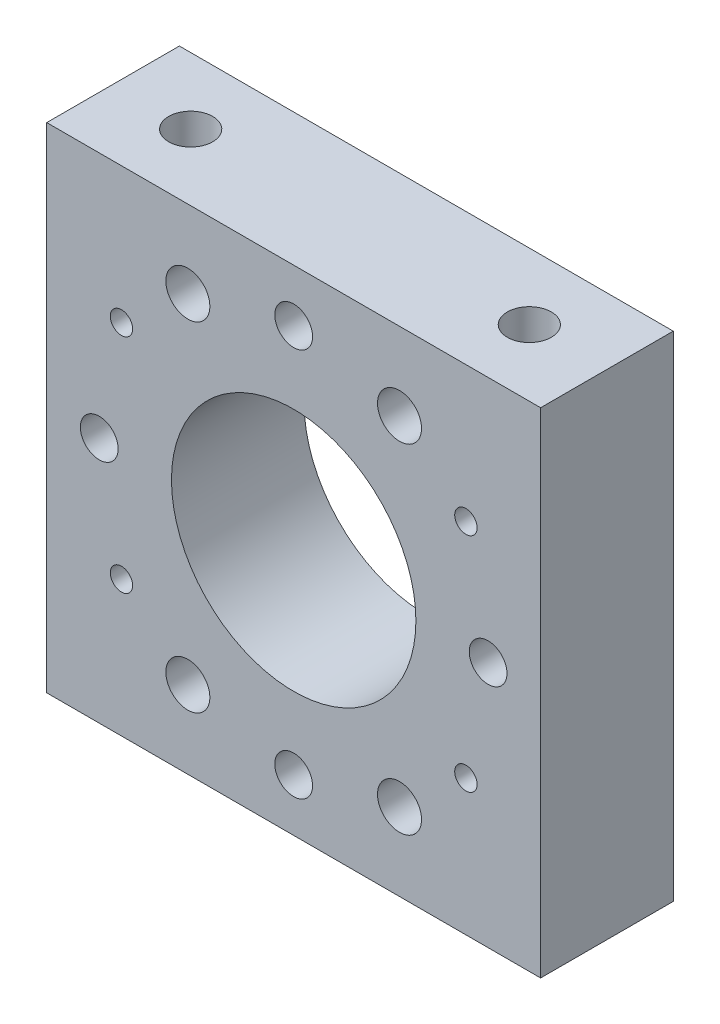
ISO-10303-21;
HEADER;
FILE_DESCRIPTION(('STEP AP214'),'2;1');
FILE_NAME('part.step','',(''),(''),'','','');
FILE_SCHEMA(('AUTOMOTIVE_DESIGN { 1 0 10303 214 1 1 1 1 }'));
ENDSEC;
DATA;
#1=APPLICATION_CONTEXT('core data for automotive mechanical design processes');
#2=APPLICATION_PROTOCOL_DEFINITION('international standard','automotive_design',2000,#1);
#3=PRODUCT_CONTEXT('',#1,'mechanical');
#4=PRODUCT('Part','Part','',(#3));
#5=PRODUCT_RELATED_PRODUCT_CATEGORY('part','',(#4));
#6=PRODUCT_DEFINITION_FORMATION('','',#4);
#7=PRODUCT_DEFINITION_CONTEXT('part definition',#1,'design');
#8=PRODUCT_DEFINITION('design','',#6,#7);
#9=PRODUCT_DEFINITION_SHAPE('','',#8);
#10=(LENGTH_UNIT() NAMED_UNIT(*) SI_UNIT(.MILLI.,.METRE.));
#11=(NAMED_UNIT(*) PLANE_ANGLE_UNIT() SI_UNIT($,.RADIAN.));
#12=(NAMED_UNIT(*) SI_UNIT($,.STERADIAN.) SOLID_ANGLE_UNIT());
#13=UNCERTAINTY_MEASURE_WITH_UNIT(LENGTH_MEASURE(1.E-05),#10,'distance_accuracy_value','');
#14=(GEOMETRIC_REPRESENTATION_CONTEXT(3) GLOBAL_UNCERTAINTY_ASSIGNED_CONTEXT((#13)) GLOBAL_UNIT_ASSIGNED_CONTEXT((#10,
#11,#12)) REPRESENTATION_CONTEXT('',''));
#15=CARTESIAN_POINT('',(0.,0.,0.));
#16=DIRECTION('',(0.,0.,1.));
#17=DIRECTION('',(1.,0.,0.));
#18=AXIS2_PLACEMENT_3D('',#15,#16,#17);
#19=CARTESIAN_POINT('',(-15.24,16.2250000010999,0.));
#20=DIRECTION('',(0.,1.,0.));
#21=DIRECTION('',(0.,0.,1.));
#22=AXIS2_PLACEMENT_3D('',#19,#20,#21);
#23=CONICAL_SURFACE('',#22,1.98099999921056,1.02974425749285);
#24=CARTESIAN_POINT('',(-15.240000000091,15.0346951120923,0.));
#25=VERTEX_POINT('',#24);
#26=VERTEX_LOOP('',#25);
#27=FACE_BOUND('',#26,.T.);
#28=CARTESIAN_POINT('',(-15.24,16.225,0.));
#29=DIRECTION('',(0.,-1.,0.));
#30=DIRECTION('',(0.,0.,-1.));
#31=AXIS2_PLACEMENT_3D('',#28,#29,#30);
#32=CIRCLE('',#31,1.981);
#33=CARTESIAN_POINT('',(-15.24,16.225,-1.981));
#34=VERTEX_POINT('',#33);
#35=EDGE_CURVE('E74',#34,#34,#32,.F.);
#36=ORIENTED_EDGE('',*,*,#35,.T.);
#37=EDGE_LOOP('',(#36));
#38=FACE_BOUND('',#37,.T.);
#39=ADVANCED_FACE('F17',(#27,#38),#23,.F.);
#40=CARTESIAN_POINT('',(15.24,16.225,0.));
#41=DIRECTION('',(0.,1.,0.));
#42=DIRECTION('',(-1.,0.,0.));
#43=AXIS2_PLACEMENT_3D('',#40,#41,#42);
#44=CONICAL_SURFACE('',#43,1.981,1.02974425867665);
#45=CARTESIAN_POINT('',(15.24,15.0346951137064,0.));
#46=VERTEX_POINT('',#45);
#47=VERTEX_LOOP('',#46);
#48=FACE_BOUND('',#47,.T.);
#49=CARTESIAN_POINT('',(15.24,16.225,0.));
#50=DIRECTION('',(0.,1.,0.));
#51=DIRECTION('',(-1.,0.,0.));
#52=AXIS2_PLACEMENT_3D('',#49,#50,#51);
#53=CIRCLE('',#52,1.981);
#54=CARTESIAN_POINT('',(13.259,16.225,0.));
#55=VERTEX_POINT('',#54);
#56=EDGE_CURVE('E76',#55,#55,#53,.T.);
#57=ORIENTED_EDGE('',*,*,#56,.T.);
#58=EDGE_LOOP('',(#57));
#59=FACE_BOUND('',#58,.T.);
#60=ADVANCED_FACE('F70',(#48,#59),#44,.F.);
#61=CARTESIAN_POINT('',(-15.24,-16.225,0.));
#62=DIRECTION('',(0.,-1.,0.));
#63=DIRECTION('',(1.,0.,0.));
#64=AXIS2_PLACEMENT_3D('',#61,#62,#63);
#65=CONICAL_SURFACE('',#64,1.981,1.02974425867665);
#66=CARTESIAN_POINT('',(-15.24,-15.0346951137064,0.));
#67=VERTEX_POINT('',#66);
#68=VERTEX_LOOP('',#67);
#69=FACE_BOUND('',#68,.T.);
#70=CARTESIAN_POINT('',(-15.24,-16.225,0.));
#71=DIRECTION('',(0.,-1.,0.));
#72=DIRECTION('',(1.,0.,0.));
#73=AXIS2_PLACEMENT_3D('',#70,#71,#72);
#74=CIRCLE('',#73,1.981);
#75=CARTESIAN_POINT('',(-13.259,-16.225,0.));
#76=VERTEX_POINT('',#75);
#77=EDGE_CURVE('E79',#76,#76,#74,.T.);
#78=ORIENTED_EDGE('',*,*,#77,.T.);
#79=EDGE_LOOP('',(#78));
#80=FACE_BOUND('',#79,.T.);
#81=ADVANCED_FACE('F330',(#69,#80),#65,.F.);
#82=CARTESIAN_POINT('',(15.24,-16.2250000010999,0.));
#83=DIRECTION('',(0.,-1.,0.));
#84=DIRECTION('',(0.,0.,-1.));
#85=AXIS2_PLACEMENT_3D('',#82,#83,#84);
#86=CONICAL_SURFACE('',#85,1.98099999921056,1.02974425749285);
#87=CARTESIAN_POINT('',(15.240000000091,-15.0346951120923,0.));
#88=VERTEX_POINT('',#87);
#89=VERTEX_LOOP('',#88);
#90=FACE_BOUND('',#89,.T.);
#91=CARTESIAN_POINT('',(15.24,-16.225,0.));
#92=DIRECTION('',(0.,1.,0.));
#93=DIRECTION('',(0.,0.,1.));
#94=AXIS2_PLACEMENT_3D('',#91,#92,#93);
#95=CIRCLE('',#94,1.981);
#96=CARTESIAN_POINT('',(15.24,-16.225,1.981));
#97=VERTEX_POINT('',#96);
#98=EDGE_CURVE('E197',#97,#97,#95,.F.);
#99=ORIENTED_EDGE('',*,*,#98,.T.);
#100=EDGE_LOOP('',(#99));
#101=FACE_BOUND('',#100,.T.);
#102=ADVANCED_FACE('F327',(#90,#101),#86,.F.);
#103=CARTESIAN_POINT('',(0.,-17.5,-5.969));
#104=DIRECTION('',(0.,0.,1.));
#105=DIRECTION('',(1.,0.,0.));
#106=AXIS2_PLACEMENT_3D('',#103,#104,#105);
#107=CYLINDRICAL_SURFACE('',#106,3.);
#108=CARTESIAN_POINT('',(0.,-17.5,-0.469000000000004));
#109=DIRECTION('',(0.,0.,1.));
#110=DIRECTION('',(1.,0.,0.));
#111=AXIS2_PLACEMENT_3D('',#108,#109,#110);
#112=CIRCLE('',#111,3.);
#113=CARTESIAN_POINT('',(3.,-17.5,-0.469000000000004));
#114=VERTEX_POINT('',#113);
#115=EDGE_CURVE('E21',#114,#114,#112,.T.);
#116=ORIENTED_EDGE('',*,*,#115,.T.);
#117=EDGE_LOOP('',(#116));
#118=FACE_BOUND('',#117,.T.);
#119=CARTESIAN_POINT('',(0.,-17.5,-5.969));
#120=DIRECTION('',(0.,0.,1.));
#121=DIRECTION('',(1.,0.,0.));
#122=AXIS2_PLACEMENT_3D('',#119,#120,#121);
#123=CIRCLE('',#122,3.);
#124=CARTESIAN_POINT('',(3.,-17.5,-5.969));
#125=VERTEX_POINT('',#124);
#126=EDGE_CURVE('E184',#125,#125,#123,.F.);
#127=ORIENTED_EDGE('',*,*,#126,.T.);
#128=EDGE_LOOP('',(#127));
#129=FACE_BOUND('',#128,.T.);
#130=ADVANCED_FACE('F329',(#118,#129),#107,.F.);
#131=CARTESIAN_POINT('',(17.5,0.,-5.969));
#132=DIRECTION('',(0.,0.,1.));
#133=DIRECTION('',(1.,0.,0.));
#134=AXIS2_PLACEMENT_3D('',#131,#132,#133);
#135=CYLINDRICAL_SURFACE('',#134,3.);
#136=CARTESIAN_POINT('',(17.5,0.,-0.469000000000004));
#137=DIRECTION('',(0.,0.,1.));
#138=DIRECTION('',(1.,0.,0.));
#139=AXIS2_PLACEMENT_3D('',#136,#137,#138);
#140=CIRCLE('',#139,3.);
#141=CARTESIAN_POINT('',(20.5,0.,-0.469000000000004));
#142=VERTEX_POINT('',#141);
#143=EDGE_CURVE('E192',#142,#142,#140,.T.);
#144=ORIENTED_EDGE('',*,*,#143,.T.);
#145=EDGE_LOOP('',(#144));
#146=FACE_BOUND('',#145,.T.);
#147=CARTESIAN_POINT('',(17.5,0.,-5.969));
#148=DIRECTION('',(0.,0.,1.));
#149=DIRECTION('',(1.,0.,0.));
#150=AXIS2_PLACEMENT_3D('',#147,#148,#149);
#151=CIRCLE('',#150,3.);
#152=CARTESIAN_POINT('',(20.5,0.,-5.969));
#153=VERTEX_POINT('',#152);
#154=EDGE_CURVE('E181',#153,#153,#151,.F.);
#155=ORIENTED_EDGE('',*,*,#154,.T.);
#156=EDGE_LOOP('',(#155));
#157=FACE_BOUND('',#156,.T.);
#158=ADVANCED_FACE('F340',(#146,#157),#135,.F.);
#159=CARTESIAN_POINT('',(-17.5,0.,-5.969));
#160=DIRECTION('',(0.,0.,1.));
#161=DIRECTION('',(1.,0.,0.));
#162=AXIS2_PLACEMENT_3D('',#159,#160,#161);
#163=CYLINDRICAL_SURFACE('',#162,3.);
#164=CARTESIAN_POINT('',(-17.5,0.,-0.469000000000004));
#165=DIRECTION('',(0.,0.,1.));
#166=DIRECTION('',(1.,0.,0.));
#167=AXIS2_PLACEMENT_3D('',#164,#165,#166);
#168=CIRCLE('',#167,3.);
#169=CARTESIAN_POINT('',(-14.5,0.,-0.469000000000004));
#170=VERTEX_POINT('',#169);
#171=EDGE_CURVE('E190',#170,#170,#168,.T.);
#172=ORIENTED_EDGE('',*,*,#171,.T.);
#173=EDGE_LOOP('',(#172));
#174=FACE_BOUND('',#173,.T.);
#175=CARTESIAN_POINT('',(-17.5,0.,-5.969));
#176=DIRECTION('',(0.,0.,1.));
#177=DIRECTION('',(1.,0.,0.));
#178=AXIS2_PLACEMENT_3D('',#175,#176,#177);
#179=CIRCLE('',#178,3.);
#180=CARTESIAN_POINT('',(-14.5,0.,-5.969));
#181=VERTEX_POINT('',#180);
#182=EDGE_CURVE('E178',#181,#181,#179,.F.);
#183=ORIENTED_EDGE('',*,*,#182,.T.);
#184=EDGE_LOOP('',(#183));
#185=FACE_BOUND('',#184,.T.);
#186=ADVANCED_FACE('F343',(#174,#185),#163,.F.);
#187=CARTESIAN_POINT('',(0.,17.5,-5.969));
#188=DIRECTION('',(0.,0.,1.));
#189=DIRECTION('',(1.,0.,0.));
#190=AXIS2_PLACEMENT_3D('',#187,#188,#189);
#191=CYLINDRICAL_SURFACE('',#190,3.);
#192=CARTESIAN_POINT('',(0.,17.5,-0.469000000000004));
#193=DIRECTION('',(0.,0.,1.));
#194=DIRECTION('',(1.,0.,0.));
#195=AXIS2_PLACEMENT_3D('',#192,#193,#194);
#196=CIRCLE('',#195,3.);
#197=CARTESIAN_POINT('',(3.,17.5,-0.469000000000004));
#198=VERTEX_POINT('',#197);
#199=EDGE_CURVE('E187',#198,#198,#196,.T.);
#200=ORIENTED_EDGE('',*,*,#199,.T.);
#201=EDGE_LOOP('',(#200));
#202=FACE_BOUND('',#201,.T.);
#203=CARTESIAN_POINT('',(0.,17.5,-5.969));
#204=DIRECTION('',(0.,0.,1.));
#205=DIRECTION('',(1.,0.,0.));
#206=AXIS2_PLACEMENT_3D('',#203,#204,#205);
#207=CIRCLE('',#206,3.);
#208=CARTESIAN_POINT('',(3.,17.5,-5.969));
#209=VERTEX_POINT('',#208);
#210=EDGE_CURVE('E174',#209,#209,#207,.F.);
#211=ORIENTED_EDGE('',*,*,#210,.T.);
#212=EDGE_LOOP('',(#211));
#213=FACE_BOUND('',#212,.T.);
#214=ADVANCED_FACE('F325',(#202,#213),#191,.F.);
#215=CARTESIAN_POINT('',(-15.24,19.225,0.));
#216=DIRECTION('',(0.,-1.,0.));
#217=DIRECTION('',(0.,0.,-1.));
#218=AXIS2_PLACEMENT_3D('',#215,#216,#217);
#219=CYLINDRICAL_SURFACE('',#218,1.981);
#220=CARTESIAN_POINT('',(-15.24,22.225,0.));
#221=DIRECTION('',(0.,-1.,0.));
#222=DIRECTION('',(0.,0.,-1.));
#223=AXIS2_PLACEMENT_3D('',#220,#221,#222);
#224=CIRCLE('',#223,1.981);
#225=CARTESIAN_POINT('',(-15.24,22.225,-1.981));
#226=VERTEX_POINT('',#225);
#227=EDGE_CURVE('E170',#226,#226,#224,.T.);
#228=ORIENTED_EDGE('',*,*,#227,.F.);
#229=EDGE_LOOP('',(#228));
#230=FACE_BOUND('',#229,.T.);
#231=ORIENTED_EDGE('',*,*,#35,.F.);
#232=EDGE_LOOP('',(#231));
#233=FACE_BOUND('',#232,.T.);
#234=ADVANCED_FACE('F321',(#230,#233),#219,.F.);
#235=CARTESIAN_POINT('',(15.24,22.225,0.));
#236=DIRECTION('',(0.,-1.,0.));
#237=DIRECTION('',(0.,0.,-1.));
#238=AXIS2_PLACEMENT_3D('',#235,#236,#237);
#239=CYLINDRICAL_SURFACE('',#238,1.981);
#240=CARTESIAN_POINT('',(15.24,22.225,0.));
#241=DIRECTION('',(0.,-1.,0.));
#242=DIRECTION('',(0.,0.,-1.));
#243=AXIS2_PLACEMENT_3D('',#240,#241,#242);
#244=CIRCLE('',#243,1.981);
#245=CARTESIAN_POINT('',(15.24,22.225,-1.981));
#246=VERTEX_POINT('',#245);
#247=EDGE_CURVE('E166',#246,#246,#244,.T.);
#248=ORIENTED_EDGE('',*,*,#247,.F.);
#249=EDGE_LOOP('',(#248));
#250=FACE_BOUND('',#249,.T.);
#251=ORIENTED_EDGE('',*,*,#56,.F.);
#252=EDGE_LOOP('',(#251));
#253=FACE_BOUND('',#252,.T.);
#254=ADVANCED_FACE('F324',(#250,#253),#239,.F.);
#255=CARTESIAN_POINT('',(-15.24,-22.225,0.));
#256=DIRECTION('',(0.,1.,0.));
#257=DIRECTION('',(0.,0.,1.));
#258=AXIS2_PLACEMENT_3D('',#255,#256,#257);
#259=CYLINDRICAL_SURFACE('',#258,1.981);
#260=CARTESIAN_POINT('',(-15.24,-22.225,0.));
#261=DIRECTION('',(0.,1.,0.));
#262=DIRECTION('',(0.,0.,1.));
#263=AXIS2_PLACEMENT_3D('',#260,#261,#262);
#264=CIRCLE('',#263,1.981);
#265=CARTESIAN_POINT('',(-15.24,-22.225,1.981));
#266=VERTEX_POINT('',#265);
#267=EDGE_CURVE('E162',#266,#266,#264,.T.);
#268=ORIENTED_EDGE('',*,*,#267,.F.);
#269=EDGE_LOOP('',(#268));
#270=FACE_BOUND('',#269,.T.);
#271=ORIENTED_EDGE('',*,*,#77,.F.);
#272=EDGE_LOOP('',(#271));
#273=FACE_BOUND('',#272,.T.);
#274=ADVANCED_FACE('F319',(#270,#273),#259,.F.);
#275=CARTESIAN_POINT('',(15.24,-19.225,0.));
#276=DIRECTION('',(0.,1.,0.));
#277=DIRECTION('',(0.,0.,1.));
#278=AXIS2_PLACEMENT_3D('',#275,#276,#277);
#279=CYLINDRICAL_SURFACE('',#278,1.981);
#280=CARTESIAN_POINT('',(15.24,-22.225,0.));
#281=DIRECTION('',(0.,1.,0.));
#282=DIRECTION('',(0.,0.,1.));
#283=AXIS2_PLACEMENT_3D('',#280,#281,#282);
#284=CIRCLE('',#283,1.981);
#285=CARTESIAN_POINT('',(15.24,-22.225,1.981));
#286=VERTEX_POINT('',#285);
#287=EDGE_CURVE('E159',#286,#286,#284,.T.);
#288=ORIENTED_EDGE('',*,*,#287,.F.);
#289=EDGE_LOOP('',(#288));
#290=FACE_BOUND('',#289,.T.);
#291=ORIENTED_EDGE('',*,*,#98,.F.);
#292=EDGE_LOOP('',(#291));
#293=FACE_BOUND('',#292,.T.);
#294=ADVANCED_FACE('F315',(#290,#293),#279,.F.);
#295=CARTESIAN_POINT('',(-2.99999999999999,-20.56,-0.469000000000004));
#296=DIRECTION('',(0.,0.,1.));
#297=DIRECTION('',(1.,0.,0.));
#298=AXIS2_PLACEMENT_3D('',#295,#296,#297);
#299=PLANE('',#298);
#300=CARTESIAN_POINT('',(0.,-17.5,-0.469000000000004));
#301=DIRECTION('',(0.,0.,1.));
#302=DIRECTION('',(1.,0.,0.));
#303=AXIS2_PLACEMENT_3D('',#300,#301,#302);
#304=CIRCLE('',#303,1.70000000000001);
#305=CARTESIAN_POINT('',(1.70000000000001,-17.5,-0.469000000000004));
#306=VERTEX_POINT('',#305);
#307=EDGE_CURVE('E132',#306,#306,#304,.T.);
#308=ORIENTED_EDGE('',*,*,#307,.T.);
#309=EDGE_LOOP('',(#308));
#310=FACE_BOUND('',#309,.T.);
#311=ORIENTED_EDGE('',*,*,#115,.F.);
#312=EDGE_LOOP('',(#311));
#313=FACE_BOUND('',#312,.T.);
#314=ADVANCED_FACE('F318',(#310,#313),#299,.F.);
#315=CARTESIAN_POINT('',(20.56,-2.99999999999999,-0.469000000000004));
#316=DIRECTION('',(0.,0.,1.));
#317=DIRECTION('',(0.,1.,0.));
#318=AXIS2_PLACEMENT_3D('',#315,#316,#317);
#319=PLANE('',#318);
#320=CARTESIAN_POINT('',(17.5,0.,-0.469000000000004));
#321=DIRECTION('',(0.,0.,1.));
#322=DIRECTION('',(1.,0.,0.));
#323=AXIS2_PLACEMENT_3D('',#320,#321,#322);
#324=CIRCLE('',#323,1.70000000000001);
#325=CARTESIAN_POINT('',(19.2,0.,-0.469000000000004));
#326=VERTEX_POINT('',#325);
#327=EDGE_CURVE('E129',#326,#326,#324,.T.);
#328=ORIENTED_EDGE('',*,*,#327,.T.);
#329=EDGE_LOOP('',(#328));
#330=FACE_BOUND('',#329,.T.);
#331=ORIENTED_EDGE('',*,*,#143,.F.);
#332=EDGE_LOOP('',(#331));
#333=FACE_BOUND('',#332,.T.);
#334=ADVANCED_FACE('F358',(#330,#333),#319,.F.);
#335=CARTESIAN_POINT('',(-20.56,2.99999999999999,-0.469000000000004));
#336=DIRECTION('',(0.,0.,1.));
#337=DIRECTION('',(0.,-1.,0.));
#338=AXIS2_PLACEMENT_3D('',#335,#336,#337);
#339=PLANE('',#338);
#340=CARTESIAN_POINT('',(-17.5,0.,-0.469000000000004));
#341=DIRECTION('',(0.,0.,1.));
#342=DIRECTION('',(1.,0.,0.));
#343=AXIS2_PLACEMENT_3D('',#340,#341,#342);
#344=CIRCLE('',#343,1.70000000000001);
#345=CARTESIAN_POINT('',(-15.8,0.,-0.469000000000004));
#346=VERTEX_POINT('',#345);
#347=EDGE_CURVE('E126',#346,#346,#344,.T.);
#348=ORIENTED_EDGE('',*,*,#347,.T.);
#349=EDGE_LOOP('',(#348));
#350=FACE_BOUND('',#349,.T.);
#351=ORIENTED_EDGE('',*,*,#171,.F.);
#352=EDGE_LOOP('',(#351));
#353=FACE_BOUND('',#352,.T.);
#354=ADVANCED_FACE('F310',(#350,#353),#339,.F.);
#355=CARTESIAN_POINT('',(2.99999999999999,20.56,-0.469000000000004));
#356=DIRECTION('',(0.,0.,1.));
#357=DIRECTION('',(-1.,0.,0.));
#358=AXIS2_PLACEMENT_3D('',#355,#356,#357);
#359=PLANE('',#358);
#360=CARTESIAN_POINT('',(0.,17.5,-0.469000000000004));
#361=DIRECTION('',(0.,0.,1.));
#362=DIRECTION('',(1.,0.,0.));
#363=AXIS2_PLACEMENT_3D('',#360,#361,#362);
#364=CIRCLE('',#363,1.70000000000001);
#365=CARTESIAN_POINT('',(1.70000000000001,17.5,-0.469000000000004));
#366=VERTEX_POINT('',#365);
#367=EDGE_CURVE('E123',#366,#366,#364,.T.);
#368=ORIENTED_EDGE('',*,*,#367,.T.);
#369=EDGE_LOOP('',(#368));
#370=FACE_BOUND('',#369,.T.);
#371=ORIENTED_EDGE('',*,*,#199,.F.);
#372=EDGE_LOOP('',(#371));
#373=FACE_BOUND('',#372,.T.);
#374=ADVANCED_FACE('F300',(#370,#373),#359,.F.);
#375=CARTESIAN_POINT('',(0.,0.,-5.969));
#376=DIRECTION('',(0.,0.,1.));
#377=DIRECTION('',(1.,0.,0.));
#378=AXIS2_PLACEMENT_3D('',#375,#376,#377);
#379=PLANE('',#378);
#380=CARTESIAN_POINT('',(0.,0.,-5.969));
#381=DIRECTION('',(0.,0.,1.));
#382=DIRECTION('',(1.,0.,0.));
#383=AXIS2_PLACEMENT_3D('',#380,#381,#382);
#384=CIRCLE('',#383,11.);
#385=CARTESIAN_POINT('',(11.,0.,-5.969));
#386=VERTEX_POINT('',#385);
#387=EDGE_CURVE('E119',#386,#386,#384,.T.);
#388=ORIENTED_EDGE('',*,*,#387,.T.);
#389=EDGE_LOOP('',(#388));
#390=FACE_BOUND('',#389,.T.);
#391=ORIENTED_EDGE('',*,*,#210,.F.);
#392=EDGE_LOOP('',(#391));
#393=FACE_BOUND('',#392,.T.);
#394=ORIENTED_EDGE('',*,*,#182,.F.);
#395=EDGE_LOOP('',(#394));
#396=FACE_BOUND('',#395,.T.);
#397=ORIENTED_EDGE('',*,*,#154,.F.);
#398=EDGE_LOOP('',(#397));
#399=FACE_BOUND('',#398,.T.);
#400=ORIENTED_EDGE('',*,*,#126,.F.);
#401=EDGE_LOOP('',(#400));
#402=FACE_BOUND('',#401,.T.);
#403=CARTESIAN_POINT('',(9.525,15.24,-5.969));
#404=DIRECTION('',(0.,0.,1.));
#405=DIRECTION('',(1.,0.,0.));
#406=AXIS2_PLACEMENT_3D('',#403,#404,#405);
#407=CIRCLE('',#406,1.981);
#408=CARTESIAN_POINT('',(11.506,15.24,-5.969));
#409=VERTEX_POINT('',#408);
#410=EDGE_CURVE('E135',#409,#409,#407,.T.);
#411=ORIENTED_EDGE('',*,*,#410,.T.);
#412=EDGE_LOOP('',(#411));
#413=FACE_BOUND('',#412,.T.);
#414=CARTESIAN_POINT('',(-9.525,15.24,-5.96899999999999));
#415=DIRECTION('',(0.,0.,1.));
#416=DIRECTION('',(1.,0.,0.));
#417=AXIS2_PLACEMENT_3D('',#414,#415,#416);
#418=CIRCLE('',#417,1.981);
#419=CARTESIAN_POINT('',(-7.544,15.24,-5.96899999999999));
#420=VERTEX_POINT('',#419);
#421=EDGE_CURVE('E138',#420,#420,#418,.T.);
#422=ORIENTED_EDGE('',*,*,#421,.T.);
#423=EDGE_LOOP('',(#422));
#424=FACE_BOUND('',#423,.T.);
#425=CARTESIAN_POINT('',(9.525,-15.24,-5.96899999999999));
#426=DIRECTION('',(0.,0.,1.));
#427=DIRECTION('',(1.,0.,0.));
#428=AXIS2_PLACEMENT_3D('',#425,#426,#427);
#429=CIRCLE('',#428,1.981);
#430=CARTESIAN_POINT('',(11.506,-15.24,-5.96899999999999));
#431=VERTEX_POINT('',#430);
#432=EDGE_CURVE('E141',#431,#431,#429,.T.);
#433=ORIENTED_EDGE('',*,*,#432,.T.);
#434=EDGE_LOOP('',(#433));
#435=FACE_BOUND('',#434,.T.);
#436=CARTESIAN_POINT('',(-9.525,-15.24,-5.969));
#437=DIRECTION('',(0.,0.,1.));
#438=DIRECTION('',(1.,0.,0.));
#439=AXIS2_PLACEMENT_3D('',#436,#437,#438);
#440=CIRCLE('',#439,1.981);
#441=CARTESIAN_POINT('',(-7.544,-15.24,-5.969));
#442=VERTEX_POINT('',#441);
#443=EDGE_CURVE('E144',#442,#442,#440,.T.);
#444=ORIENTED_EDGE('',*,*,#443,.T.);
#445=EDGE_LOOP('',(#444));
#446=FACE_BOUND('',#445,.T.);
#447=CARTESIAN_POINT('',(15.5,10.,-5.969));
#448=DIRECTION('',(0.,0.,1.));
#449=DIRECTION('',(1.,0.,0.));
#450=AXIS2_PLACEMENT_3D('',#447,#448,#449);
#451=CIRCLE('',#450,1.00650000000002);
#452=CARTESIAN_POINT('',(16.5065,10.,-5.969));
#453=VERTEX_POINT('',#452);
#454=EDGE_CURVE('E147',#453,#453,#451,.T.);
#455=ORIENTED_EDGE('',*,*,#454,.T.);
#456=EDGE_LOOP('',(#455));
#457=FACE_BOUND('',#456,.T.);
#458=CARTESIAN_POINT('',(15.5,-10.,-5.96899999999999));
#459=DIRECTION('',(0.,0.,1.));
#460=DIRECTION('',(1.,0.,0.));
#461=AXIS2_PLACEMENT_3D('',#458,#459,#460);
#462=CIRCLE('',#461,1.00650000000001);
#463=CARTESIAN_POINT('',(16.5065,-10.,-5.96899999999999));
#464=VERTEX_POINT('',#463);
#465=EDGE_CURVE('E150',#464,#464,#462,.T.);
#466=ORIENTED_EDGE('',*,*,#465,.T.);
#467=EDGE_LOOP('',(#466));
#468=FACE_BOUND('',#467,.T.);
#469=CARTESIAN_POINT('',(-15.5,10.,-5.96899999999999));
#470=DIRECTION('',(0.,0.,1.));
#471=DIRECTION('',(1.,0.,0.));
#472=AXIS2_PLACEMENT_3D('',#469,#470,#471);
#473=CIRCLE('',#472,1.00650000000001);
#474=CARTESIAN_POINT('',(-14.4935,10.,-5.96899999999999));
#475=VERTEX_POINT('',#474);
#476=EDGE_CURVE('E153',#475,#475,#473,.T.);
#477=ORIENTED_EDGE('',*,*,#476,.T.);
#478=EDGE_LOOP('',(#477));
#479=FACE_BOUND('',#478,.T.);
#480=CARTESIAN_POINT('',(-15.5,-10.,-5.969));
#481=DIRECTION('',(0.,0.,1.));
#482=DIRECTION('',(1.,0.,0.));
#483=AXIS2_PLACEMENT_3D('',#480,#481,#482);
#484=CIRCLE('',#483,1.00650000000002);
#485=CARTESIAN_POINT('',(-14.4935,-10.,-5.969));
#486=VERTEX_POINT('',#485);
#487=EDGE_CURVE('E156',#486,#486,#484,.T.);
#488=ORIENTED_EDGE('',*,*,#487,.T.);
#489=EDGE_LOOP('',(#488));
#490=FACE_BOUND('',#489,.T.);
#491=DIRECTION('',(1.,0.,0.));
#492=VECTOR('',#491,1.);
#493=CARTESIAN_POINT('',(-22.225,22.225,-5.969));
#494=LINE('',#493,#492);
#495=CARTESIAN_POINT('',(22.225,22.225,-5.969));
#496=VERTEX_POINT('',#495);
#497=CARTESIAN_POINT('',(-22.225,22.225,-5.969));
#498=VERTEX_POINT('',#497);
#499=EDGE_CURVE('E173',#496,#498,#494,.F.);
#500=ORIENTED_EDGE('',*,*,#499,.F.);
#501=DIRECTION('',(0.,1.,0.));
#502=VECTOR('',#501,1.);
#503=CARTESIAN_POINT('',(22.225,22.225,-5.969));
#504=LINE('',#503,#502);
#505=CARTESIAN_POINT('',(22.225,-22.225,-5.969));
#506=VERTEX_POINT('',#505);
#507=EDGE_CURVE('E177',#506,#496,#504,.T.);
#508=ORIENTED_EDGE('',*,*,#507,.F.);
#509=DIRECTION('',(1.,0.,0.));
#510=VECTOR('',#509,1.);
#511=CARTESIAN_POINT('',(22.225,-22.225,-5.969));
#512=LINE('',#511,#510);
#513=CARTESIAN_POINT('',(-22.225,-22.225,-5.969));
#514=VERTEX_POINT('',#513);
#515=EDGE_CURVE('E216',#514,#506,#512,.T.);
#516=ORIENTED_EDGE('',*,*,#515,.F.);
#517=DIRECTION('',(0.,1.,0.));
#518=VECTOR('',#517,1.);
#519=CARTESIAN_POINT('',(-22.225,-22.225,-5.969));
#520=LINE('',#519,#518);
#521=EDGE_CURVE('E213',#498,#514,#520,.F.);
#522=ORIENTED_EDGE('',*,*,#521,.F.);
#523=EDGE_LOOP('',(#500,#508,#516,#522));
#524=FACE_BOUND('',#523,.T.);
#525=ADVANCED_FACE('F297',(#390,#393,#396,#399,#402,#413,#424,#435,#446,#457,#468,#479,#490,
#524),#379,.F.);
#526=CARTESIAN_POINT('',(22.225,22.225,0.));
#527=DIRECTION('',(1.,0.,0.));
#528=DIRECTION('',(0.,0.,-1.));
#529=AXIS2_PLACEMENT_3D('',#526,#527,#528);
#530=PLANE('',#529);
#531=ORIENTED_EDGE('',*,*,#507,.T.);
#532=DIRECTION('',(0.,0.,1.));
#533=VECTOR('',#532,1.);
#534=CARTESIAN_POINT('',(22.225,22.225,0.));
#535=LINE('',#534,#533);
#536=CARTESIAN_POINT('',(22.225,22.225,5.969));
#537=VERTEX_POINT('',#536);
#538=EDGE_CURVE('E207',#537,#496,#535,.F.);
#539=ORIENTED_EDGE('',*,*,#538,.F.);
#540=DIRECTION('',(0.,1.,0.));
#541=VECTOR('',#540,1.);
#542=CARTESIAN_POINT('',(22.225,0.,5.969));
#543=LINE('',#542,#541);
#544=CARTESIAN_POINT('',(22.225,-22.225,5.969));
#545=VERTEX_POINT('',#544);
#546=EDGE_CURVE('E122',#545,#537,#543,.T.);
#547=ORIENTED_EDGE('',*,*,#546,.F.);
#548=DIRECTION('',(0.,0.,-1.));
#549=VECTOR('',#548,1.);
#550=CARTESIAN_POINT('',(22.225,-22.225,0.));
#551=LINE('',#550,#549);
#552=EDGE_CURVE('E165',#506,#545,#551,.F.);
#553=ORIENTED_EDGE('',*,*,#552,.F.);
#554=EDGE_LOOP('',(#531,#539,#547,#553));
#555=FACE_BOUND('',#554,.T.);
#556=ADVANCED_FACE('F237',(#555),#530,.T.);
#557=CARTESIAN_POINT('',(-22.225,22.225,0.));
#558=DIRECTION('',(0.,1.,0.));
#559=DIRECTION('',(0.,0.,1.));
#560=AXIS2_PLACEMENT_3D('',#557,#558,#559);
#561=PLANE('',#560);
#562=ORIENTED_EDGE('',*,*,#247,.T.);
#563=EDGE_LOOP('',(#562));
#564=FACE_BOUND('',#563,.T.);
#565=ORIENTED_EDGE('',*,*,#227,.T.);
#566=EDGE_LOOP('',(#565));
#567=FACE_BOUND('',#566,.T.);
#568=ORIENTED_EDGE('',*,*,#499,.T.);
#569=DIRECTION('',(0.,0.,1.));
#570=VECTOR('',#569,1.);
#571=CARTESIAN_POINT('',(-22.225,22.225,0.));
#572=LINE('',#571,#570);
#573=CARTESIAN_POINT('',(-22.225,22.225,5.969));
#574=VERTEX_POINT('',#573);
#575=EDGE_CURVE('E169',#574,#498,#572,.F.);
#576=ORIENTED_EDGE('',*,*,#575,.F.);
#577=DIRECTION('',(1.,0.,0.));
#578=VECTOR('',#577,1.);
#579=CARTESIAN_POINT('',(0.,22.225,5.969));
#580=LINE('',#579,#578);
#581=EDGE_CURVE('E223',#537,#574,#580,.F.);
#582=ORIENTED_EDGE('',*,*,#581,.F.);
#583=ORIENTED_EDGE('',*,*,#538,.T.);
#584=EDGE_LOOP('',(#568,#576,#582,#583));
#585=FACE_BOUND('',#584,.T.);
#586=ADVANCED_FACE('F241',(#564,#567,#585),#561,.T.);
#587=CARTESIAN_POINT('',(-22.225,-22.225,0.));
#588=DIRECTION('',(-1.,0.,0.));
#589=DIRECTION('',(0.,0.,1.));
#590=AXIS2_PLACEMENT_3D('',#587,#588,#589);
#591=PLANE('',#590);
#592=ORIENTED_EDGE('',*,*,#521,.T.);
#593=DIRECTION('',(0.,0.,-1.));
#594=VECTOR('',#593,1.);
#595=CARTESIAN_POINT('',(-22.225,-22.225,0.));
#596=LINE('',#595,#594);
#597=CARTESIAN_POINT('',(-22.225,-22.225,5.969));
#598=VERTEX_POINT('',#597);
#599=EDGE_CURVE('E36',#598,#514,#596,.T.);
#600=ORIENTED_EDGE('',*,*,#599,.F.);
#601=DIRECTION('',(0.,1.,0.));
#602=VECTOR('',#601,1.);
#603=CARTESIAN_POINT('',(-22.225,0.,5.969));
#604=LINE('',#603,#602);
#605=EDGE_CURVE('E226',#574,#598,#604,.F.);
#606=ORIENTED_EDGE('',*,*,#605,.F.);
#607=ORIENTED_EDGE('',*,*,#575,.T.);
#608=EDGE_LOOP('',(#592,#600,#606,#607));
#609=FACE_BOUND('',#608,.T.);
#610=ADVANCED_FACE('F243',(#609),#591,.T.);
#611=CARTESIAN_POINT('',(22.225,-22.225,0.));
#612=DIRECTION('',(0.,-1.,0.));
#613=DIRECTION('',(0.,0.,-1.));
#614=AXIS2_PLACEMENT_3D('',#611,#612,#613);
#615=PLANE('',#614);
#616=ORIENTED_EDGE('',*,*,#287,.T.);
#617=EDGE_LOOP('',(#616));
#618=FACE_BOUND('',#617,.T.);
#619=ORIENTED_EDGE('',*,*,#267,.T.);
#620=EDGE_LOOP('',(#619));
#621=FACE_BOUND('',#620,.T.);
#622=ORIENTED_EDGE('',*,*,#515,.T.);
#623=ORIENTED_EDGE('',*,*,#552,.T.);
#624=DIRECTION('',(1.,0.,0.));
#625=VECTOR('',#624,1.);
#626=CARTESIAN_POINT('',(0.,-22.225,5.969));
#627=LINE('',#626,#625);
#628=EDGE_CURVE('E118',#598,#545,#627,.T.);
#629=ORIENTED_EDGE('',*,*,#628,.F.);
#630=ORIENTED_EDGE('',*,*,#599,.T.);
#631=EDGE_LOOP('',(#622,#623,#629,#630));
#632=FACE_BOUND('',#631,.T.);
#633=ADVANCED_FACE('F233',(#618,#621,#632),#615,.T.);
#634=CARTESIAN_POINT('',(-15.5,-10.,-5.969));
#635=DIRECTION('',(0.,0.,1.));
#636=DIRECTION('',(1.,0.,0.));
#637=AXIS2_PLACEMENT_3D('',#634,#635,#636);
#638=CYLINDRICAL_SURFACE('',#637,1.00650000000002);
#639=ORIENTED_EDGE('',*,*,#487,.F.);
#640=EDGE_LOOP('',(#639));
#641=FACE_BOUND('',#640,.T.);
#642=CARTESIAN_POINT('',(-15.5,-10.,5.969));
#643=DIRECTION('',(0.,0.,1.));
#644=DIRECTION('',(1.,0.,0.));
#645=AXIS2_PLACEMENT_3D('',#642,#643,#644);
#646=CIRCLE('',#645,1.00650000000002);
#647=CARTESIAN_POINT('',(-14.4935,-10.,5.969));
#648=VERTEX_POINT('',#647);
#649=EDGE_CURVE('E115',#648,#648,#646,.F.);
#650=ORIENTED_EDGE('',*,*,#649,.F.);
#651=EDGE_LOOP('',(#650));
#652=FACE_BOUND('',#651,.T.);
#653=ADVANCED_FACE('F251',(#641,#652),#638,.F.);
#654=CARTESIAN_POINT('',(-15.5,10.,58.0163174095433));
#655=DIRECTION('',(0.,0.,1.));
#656=DIRECTION('',(1.,0.,0.));
#657=AXIS2_PLACEMENT_3D('',#654,#655,#656);
#658=CYLINDRICAL_SURFACE('',#657,1.00650000000001);
#659=ORIENTED_EDGE('',*,*,#476,.F.);
#660=EDGE_LOOP('',(#659));
#661=FACE_BOUND('',#660,.T.);
#662=CARTESIAN_POINT('',(-15.5,10.,5.969));
#663=DIRECTION('',(0.,0.,1.));
#664=DIRECTION('',(1.,0.,0.));
#665=AXIS2_PLACEMENT_3D('',#662,#663,#664);
#666=CIRCLE('',#665,1.00650000000001);
#667=CARTESIAN_POINT('',(-14.4935,10.,5.969));
#668=VERTEX_POINT('',#667);
#669=EDGE_CURVE('E112',#668,#668,#666,.F.);
#670=ORIENTED_EDGE('',*,*,#669,.F.);
#671=EDGE_LOOP('',(#670));
#672=FACE_BOUND('',#671,.T.);
#673=ADVANCED_FACE('F280',(#661,#672),#658,.F.);
#674=CARTESIAN_POINT('',(15.5,-10.,58.0163174095433));
#675=DIRECTION('',(0.,0.,1.));
#676=DIRECTION('',(1.,0.,0.));
#677=AXIS2_PLACEMENT_3D('',#674,#675,#676);
#678=CYLINDRICAL_SURFACE('',#677,1.00650000000001);
#679=ORIENTED_EDGE('',*,*,#465,.F.);
#680=EDGE_LOOP('',(#679));
#681=FACE_BOUND('',#680,.T.);
#682=CARTESIAN_POINT('',(15.5,-10.,5.969));
#683=DIRECTION('',(0.,0.,1.));
#684=DIRECTION('',(1.,0.,0.));
#685=AXIS2_PLACEMENT_3D('',#682,#683,#684);
#686=CIRCLE('',#685,1.00650000000001);
#687=CARTESIAN_POINT('',(16.5065,-10.,5.969));
#688=VERTEX_POINT('',#687);
#689=EDGE_CURVE('E109',#688,#688,#686,.F.);
#690=ORIENTED_EDGE('',*,*,#689,.F.);
#691=EDGE_LOOP('',(#690));
#692=FACE_BOUND('',#691,.T.);
#693=ADVANCED_FACE('F276',(#681,#692),#678,.F.);
#694=CARTESIAN_POINT('',(15.5,10.,-5.969));
#695=DIRECTION('',(0.,0.,1.));
#696=DIRECTION('',(1.,0.,0.));
#697=AXIS2_PLACEMENT_3D('',#694,#695,#696);
#698=CYLINDRICAL_SURFACE('',#697,1.00650000000002);
#699=ORIENTED_EDGE('',*,*,#454,.F.);
#700=EDGE_LOOP('',(#699));
#701=FACE_BOUND('',#700,.T.);
#702=CARTESIAN_POINT('',(15.5,10.,5.969));
#703=DIRECTION('',(0.,0.,1.));
#704=DIRECTION('',(1.,0.,0.));
#705=AXIS2_PLACEMENT_3D('',#702,#703,#704);
#706=CIRCLE('',#705,1.00650000000002);
#707=CARTESIAN_POINT('',(16.5065,10.,5.969));
#708=VERTEX_POINT('',#707);
#709=EDGE_CURVE('E106',#708,#708,#706,.F.);
#710=ORIENTED_EDGE('',*,*,#709,.F.);
#711=EDGE_LOOP('',(#710));
#712=FACE_BOUND('',#711,.T.);
#713=ADVANCED_FACE('F279',(#701,#712),#698,.F.);
#714=CARTESIAN_POINT('',(-9.525,-15.24,-5.969));
#715=DIRECTION('',(0.,0.,1.));
#716=DIRECTION('',(1.,0.,0.));
#717=AXIS2_PLACEMENT_3D('',#714,#715,#716);
#718=CYLINDRICAL_SURFACE('',#717,1.981);
#719=ORIENTED_EDGE('',*,*,#443,.F.);
#720=EDGE_LOOP('',(#719));
#721=FACE_BOUND('',#720,.T.);
#722=CARTESIAN_POINT('',(-9.525,-15.24,5.969));
#723=DIRECTION('',(0.,0.,1.));
#724=DIRECTION('',(1.,0.,0.));
#725=AXIS2_PLACEMENT_3D('',#722,#723,#724);
#726=CIRCLE('',#725,1.981);
#727=CARTESIAN_POINT('',(-7.544,-15.24,5.969));
#728=VERTEX_POINT('',#727);
#729=EDGE_CURVE('E103',#728,#728,#726,.F.);
#730=ORIENTED_EDGE('',*,*,#729,.F.);
#731=EDGE_LOOP('',(#730));
#732=FACE_BOUND('',#731,.T.);
#733=ADVANCED_FACE('F274',(#721,#732),#718,.F.);
#734=CARTESIAN_POINT('',(9.525,-15.24,58.0163174095433));
#735=DIRECTION('',(0.,0.,1.));
#736=DIRECTION('',(1.,0.,0.));
#737=AXIS2_PLACEMENT_3D('',#734,#735,#736);
#738=CYLINDRICAL_SURFACE('',#737,1.981);
#739=ORIENTED_EDGE('',*,*,#432,.F.);
#740=EDGE_LOOP('',(#739));
#741=FACE_BOUND('',#740,.T.);
#742=CARTESIAN_POINT('',(9.525,-15.24,5.969));
#743=DIRECTION('',(0.,0.,1.));
#744=DIRECTION('',(1.,0.,0.));
#745=AXIS2_PLACEMENT_3D('',#742,#743,#744);
#746=CIRCLE('',#745,1.981);
#747=CARTESIAN_POINT('',(11.506,-15.24,5.969));
#748=VERTEX_POINT('',#747);
#749=EDGE_CURVE('E100',#748,#748,#746,.F.);
#750=ORIENTED_EDGE('',*,*,#749,.F.);
#751=EDGE_LOOP('',(#750));
#752=FACE_BOUND('',#751,.T.);
#753=ADVANCED_FACE('F270',(#741,#752),#738,.F.);
#754=CARTESIAN_POINT('',(-9.525,15.24,58.0163174095433));
#755=DIRECTION('',(0.,0.,1.));
#756=DIRECTION('',(1.,0.,0.));
#757=AXIS2_PLACEMENT_3D('',#754,#755,#756);
#758=CYLINDRICAL_SURFACE('',#757,1.981);
#759=ORIENTED_EDGE('',*,*,#421,.F.);
#760=EDGE_LOOP('',(#759));
#761=FACE_BOUND('',#760,.T.);
#762=CARTESIAN_POINT('',(-9.525,15.24,5.969));
#763=DIRECTION('',(0.,0.,1.));
#764=DIRECTION('',(1.,0.,0.));
#765=AXIS2_PLACEMENT_3D('',#762,#763,#764);
#766=CIRCLE('',#765,1.981);
#767=CARTESIAN_POINT('',(-7.544,15.24,5.969));
#768=VERTEX_POINT('',#767);
#769=EDGE_CURVE('E97',#768,#768,#766,.F.);
#770=ORIENTED_EDGE('',*,*,#769,.F.);
#771=EDGE_LOOP('',(#770));
#772=FACE_BOUND('',#771,.T.);
#773=ADVANCED_FACE('F266',(#761,#772),#758,.F.);
#774=CARTESIAN_POINT('',(9.525,15.24,-5.969));
#775=DIRECTION('',(0.,0.,1.));
#776=DIRECTION('',(1.,0.,0.));
#777=AXIS2_PLACEMENT_3D('',#774,#775,#776);
#778=CYLINDRICAL_SURFACE('',#777,1.981);
#779=ORIENTED_EDGE('',*,*,#410,.F.);
#780=EDGE_LOOP('',(#779));
#781=FACE_BOUND('',#780,.T.);
#782=CARTESIAN_POINT('',(9.525,15.24,5.969));
#783=DIRECTION('',(0.,0.,1.));
#784=DIRECTION('',(1.,0.,0.));
#785=AXIS2_PLACEMENT_3D('',#782,#783,#784);
#786=CIRCLE('',#785,1.981);
#787=CARTESIAN_POINT('',(11.506,15.24,5.969));
#788=VERTEX_POINT('',#787);
#789=EDGE_CURVE('E94',#788,#788,#786,.F.);
#790=ORIENTED_EDGE('',*,*,#789,.F.);
#791=EDGE_LOOP('',(#790));
#792=FACE_BOUND('',#791,.T.);
#793=ADVANCED_FACE('F269',(#781,#792),#778,.F.);
#794=CARTESIAN_POINT('',(0.,-17.5,-0.469000000000004));
#795=DIRECTION('',(0.,0.,1.));
#796=DIRECTION('',(1.,0.,0.));
#797=AXIS2_PLACEMENT_3D('',#794,#795,#796);
#798=CYLINDRICAL_SURFACE('',#797,1.70000000000001);
#799=ORIENTED_EDGE('',*,*,#307,.F.);
#800=EDGE_LOOP('',(#799));
#801=FACE_BOUND('',#800,.T.);
#802=CARTESIAN_POINT('',(0.,-17.5,5.969));
#803=DIRECTION('',(0.,0.,1.));
#804=DIRECTION('',(1.,0.,0.));
#805=AXIS2_PLACEMENT_3D('',#802,#803,#804);
#806=CIRCLE('',#805,1.70000000000001);
#807=CARTESIAN_POINT('',(1.70000000000001,-17.5,5.969));
#808=VERTEX_POINT('',#807);
#809=EDGE_CURVE('E91',#808,#808,#806,.F.);
#810=ORIENTED_EDGE('',*,*,#809,.F.);
#811=EDGE_LOOP('',(#810));
#812=FACE_BOUND('',#811,.T.);
#813=ADVANCED_FACE('F374',(#801,#812),#798,.F.);
#814=CARTESIAN_POINT('',(17.5,0.,-0.469000000000004));
#815=DIRECTION('',(0.,0.,1.));
#816=DIRECTION('',(1.,0.,0.));
#817=AXIS2_PLACEMENT_3D('',#814,#815,#816);
#818=CYLINDRICAL_SURFACE('',#817,1.70000000000001);
#819=ORIENTED_EDGE('',*,*,#327,.F.);
#820=EDGE_LOOP('',(#819));
#821=FACE_BOUND('',#820,.T.);
#822=CARTESIAN_POINT('',(17.5,0.,5.969));
#823=DIRECTION('',(0.,0.,1.));
#824=DIRECTION('',(1.,0.,0.));
#825=AXIS2_PLACEMENT_3D('',#822,#823,#824);
#826=CIRCLE('',#825,1.70000000000001);
#827=CARTESIAN_POINT('',(19.2,0.,5.969));
#828=VERTEX_POINT('',#827);
#829=EDGE_CURVE('E88',#828,#828,#826,.F.);
#830=ORIENTED_EDGE('',*,*,#829,.F.);
#831=EDGE_LOOP('',(#830));
#832=FACE_BOUND('',#831,.T.);
#833=ADVANCED_FACE('F378',(#821,#832),#818,.F.);
#834=CARTESIAN_POINT('',(-17.5,0.,-0.469000000000004));
#835=DIRECTION('',(0.,0.,1.));
#836=DIRECTION('',(1.,0.,0.));
#837=AXIS2_PLACEMENT_3D('',#834,#835,#836);
#838=CYLINDRICAL_SURFACE('',#837,1.70000000000001);
#839=ORIENTED_EDGE('',*,*,#347,.F.);
#840=EDGE_LOOP('',(#839));
#841=FACE_BOUND('',#840,.T.);
#842=CARTESIAN_POINT('',(-17.5,0.,5.969));
#843=DIRECTION('',(0.,0.,1.));
#844=DIRECTION('',(1.,0.,0.));
#845=AXIS2_PLACEMENT_3D('',#842,#843,#844);
#846=CIRCLE('',#845,1.70000000000001);
#847=CARTESIAN_POINT('',(-15.8,0.,5.969));
#848=VERTEX_POINT('',#847);
#849=EDGE_CURVE('E85',#848,#848,#846,.F.);
#850=ORIENTED_EDGE('',*,*,#849,.F.);
#851=EDGE_LOOP('',(#850));
#852=FACE_BOUND('',#851,.T.);
#853=ADVANCED_FACE('F382',(#841,#852),#838,.F.);
#854=CARTESIAN_POINT('',(0.,17.5,-0.469000000000004));
#855=DIRECTION('',(0.,0.,1.));
#856=DIRECTION('',(1.,0.,0.));
#857=AXIS2_PLACEMENT_3D('',#854,#855,#856);
#858=CYLINDRICAL_SURFACE('',#857,1.70000000000001);
#859=ORIENTED_EDGE('',*,*,#367,.F.);
#860=EDGE_LOOP('',(#859));
#861=FACE_BOUND('',#860,.T.);
#862=CARTESIAN_POINT('',(0.,17.5,5.969));
#863=DIRECTION('',(0.,0.,1.));
#864=DIRECTION('',(1.,0.,0.));
#865=AXIS2_PLACEMENT_3D('',#862,#863,#864);
#866=CIRCLE('',#865,1.70000000000001);
#867=CARTESIAN_POINT('',(1.70000000000001,17.5,5.969));
#868=VERTEX_POINT('',#867);
#869=EDGE_CURVE('E27',#868,#868,#866,.F.);
#870=ORIENTED_EDGE('',*,*,#869,.F.);
#871=EDGE_LOOP('',(#870));
#872=FACE_BOUND('',#871,.T.);
#873=ADVANCED_FACE('F262',(#861,#872),#858,.F.);
#874=CARTESIAN_POINT('',(0.,0.,-5.969));
#875=DIRECTION('',(0.,0.,1.));
#876=DIRECTION('',(1.,0.,0.));
#877=AXIS2_PLACEMENT_3D('',#874,#875,#876);
#878=CYLINDRICAL_SURFACE('',#877,11.);
#879=ORIENTED_EDGE('',*,*,#387,.F.);
#880=EDGE_LOOP('',(#879));
#881=FACE_BOUND('',#880,.T.);
#882=CARTESIAN_POINT('',(0.,0.,5.969));
#883=DIRECTION('',(0.,0.,1.));
#884=DIRECTION('',(1.,0.,0.));
#885=AXIS2_PLACEMENT_3D('',#882,#883,#884);
#886=CIRCLE('',#885,11.);
#887=CARTESIAN_POINT('',(11.,0.,5.969));
#888=VERTEX_POINT('',#887);
#889=EDGE_CURVE('E11',#888,#888,#886,.F.);
#890=ORIENTED_EDGE('',*,*,#889,.F.);
#891=EDGE_LOOP('',(#890));
#892=FACE_BOUND('',#891,.T.);
#893=ADVANCED_FACE('F19',(#881,#892),#878,.F.);
#894=CARTESIAN_POINT('',(0.,0.,5.969));
#895=DIRECTION('',(0.,0.,1.));
#896=DIRECTION('',(1.,0.,0.));
#897=AXIS2_PLACEMENT_3D('',#894,#895,#896);
#898=PLANE('',#897);
#899=ORIENTED_EDGE('',*,*,#889,.T.);
#900=EDGE_LOOP('',(#899));
#901=FACE_BOUND('',#900,.T.);
#902=ORIENTED_EDGE('',*,*,#869,.T.);
#903=EDGE_LOOP('',(#902));
#904=FACE_BOUND('',#903,.T.);
#905=ORIENTED_EDGE('',*,*,#849,.T.);
#906=EDGE_LOOP('',(#905));
#907=FACE_BOUND('',#906,.T.);
#908=ORIENTED_EDGE('',*,*,#829,.T.);
#909=EDGE_LOOP('',(#908));
#910=FACE_BOUND('',#909,.T.);
#911=ORIENTED_EDGE('',*,*,#809,.T.);
#912=EDGE_LOOP('',(#911));
#913=FACE_BOUND('',#912,.T.);
#914=ORIENTED_EDGE('',*,*,#789,.T.);
#915=EDGE_LOOP('',(#914));
#916=FACE_BOUND('',#915,.T.);
#917=ORIENTED_EDGE('',*,*,#769,.T.);
#918=EDGE_LOOP('',(#917));
#919=FACE_BOUND('',#918,.T.);
#920=ORIENTED_EDGE('',*,*,#749,.T.);
#921=EDGE_LOOP('',(#920));
#922=FACE_BOUND('',#921,.T.);
#923=ORIENTED_EDGE('',*,*,#729,.T.);
#924=EDGE_LOOP('',(#923));
#925=FACE_BOUND('',#924,.T.);
#926=ORIENTED_EDGE('',*,*,#709,.T.);
#927=EDGE_LOOP('',(#926));
#928=FACE_BOUND('',#927,.T.);
#929=ORIENTED_EDGE('',*,*,#689,.T.);
#930=EDGE_LOOP('',(#929));
#931=FACE_BOUND('',#930,.T.);
#932=ORIENTED_EDGE('',*,*,#669,.T.);
#933=EDGE_LOOP('',(#932));
#934=FACE_BOUND('',#933,.T.);
#935=ORIENTED_EDGE('',*,*,#649,.T.);
#936=EDGE_LOOP('',(#935));
#937=FACE_BOUND('',#936,.T.);
#938=ORIENTED_EDGE('',*,*,#605,.T.);
#939=ORIENTED_EDGE('',*,*,#628,.T.);
#940=ORIENTED_EDGE('',*,*,#546,.T.);
#941=ORIENTED_EDGE('',*,*,#581,.T.);
#942=EDGE_LOOP('',(#938,#939,#940,#941));
#943=FACE_BOUND('',#942,.T.);
#944=ADVANCED_FACE('F231',(#901,#904,#907,#910,#913,#916,#919,#922,#925,#928,#931,#934,#937,
#943),#898,.T.);
#945=CLOSED_SHELL('',(#39,#60,#81,#102,#130,#158,#186,#214,#234,#254,#274,#294,#314,#334,#354,
#374,#525,#556,#586,#610,#633,#653,#673,#693,#713,#733,#753,#773,#793,#813,#833,#853,#873,#893,#944));
#946=MANIFOLD_SOLID_BREP('B1',#945);
#947=ADVANCED_BREP_SHAPE_REPRESENTATION('',(#18,#946),#14);
#948=SHAPE_DEFINITION_REPRESENTATION(#9,#947);
ENDSEC;
END-ISO-10303-21;
